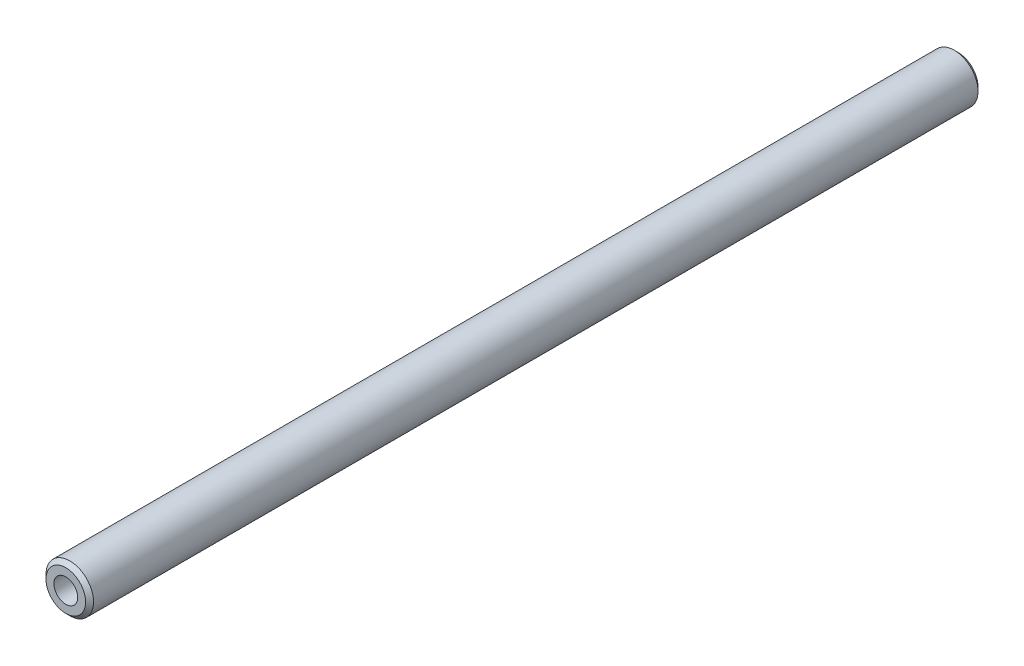
ISO-10303-21;
HEADER;
FILE_DESCRIPTION(('STEP AP214'),'2;1');
FILE_NAME('part.step','',(''),(''),'','','');
FILE_SCHEMA(('AUTOMOTIVE_DESIGN { 1 0 10303 214 1 1 1 1 }'));
ENDSEC;
DATA;
#1=APPLICATION_CONTEXT('core data for automotive mechanical design processes');
#2=APPLICATION_PROTOCOL_DEFINITION('international standard','automotive_design',2000,#1);
#3=PRODUCT_CONTEXT('',#1,'mechanical');
#4=PRODUCT('Part','Part','',(#3));
#5=PRODUCT_RELATED_PRODUCT_CATEGORY('part','',(#4));
#6=PRODUCT_DEFINITION_FORMATION('','',#4);
#7=PRODUCT_DEFINITION_CONTEXT('part definition',#1,'design');
#8=PRODUCT_DEFINITION('design','',#6,#7);
#9=PRODUCT_DEFINITION_SHAPE('','',#8);
#10=(LENGTH_UNIT() NAMED_UNIT(*) SI_UNIT(.MILLI.,.METRE.));
#11=(NAMED_UNIT(*) PLANE_ANGLE_UNIT() SI_UNIT($,.RADIAN.));
#12=(NAMED_UNIT(*) SI_UNIT($,.STERADIAN.) SOLID_ANGLE_UNIT());
#13=UNCERTAINTY_MEASURE_WITH_UNIT(LENGTH_MEASURE(1.E-05),#10,'distance_accuracy_value','');
#14=(GEOMETRIC_REPRESENTATION_CONTEXT(3) GLOBAL_UNCERTAINTY_ASSIGNED_CONTEXT((#13)) GLOBAL_UNIT_ASSIGNED_CONTEXT((#10,
#11,#12)) REPRESENTATION_CONTEXT('',''));
#15=CARTESIAN_POINT('',(0.,0.,0.));
#16=DIRECTION('',(0.,0.,1.));
#17=DIRECTION('',(1.,0.,0.));
#18=AXIS2_PLACEMENT_3D('',#15,#16,#17);
#19=CARTESIAN_POINT('',(0.,0.,225.));
#20=DIRECTION('',(0.,0.,1.));
#21=DIRECTION('',(1.,0.,0.));
#22=AXIS2_PLACEMENT_3D('',#19,#20,#21);
#23=PLANE('',#22);
#24=CARTESIAN_POINT('',(0.,0.,225.));
#25=DIRECTION('',(0.,0.,1.));
#26=DIRECTION('',(1.,0.,0.));
#27=AXIS2_PLACEMENT_3D('',#24,#25,#26);
#28=CIRCLE('',#27,4.99999999999998);
#29=CARTESIAN_POINT('',(4.99999999999998,0.,225.));
#30=VERTEX_POINT('',#29);
#31=EDGE_CURVE('E51',#30,#30,#28,.T.);
#32=ORIENTED_EDGE('',*,*,#31,.T.);
#33=EDGE_LOOP('',(#32));
#34=FACE_BOUND('',#33,.T.);
#35=CARTESIAN_POINT('',(0.,0.,225.));
#36=DIRECTION('',(0.,0.,1.));
#37=DIRECTION('',(1.,0.,0.));
#38=AXIS2_PLACEMENT_3D('',#35,#36,#37);
#39=CIRCLE('',#38,3.);
#40=CARTESIAN_POINT('',(3.,0.,225.));
#41=VERTEX_POINT('',#40);
#42=EDGE_CURVE('E56',#41,#41,#39,.T.);
#43=ORIENTED_EDGE('',*,*,#42,.F.);
#44=EDGE_LOOP('',(#43));
#45=FACE_BOUND('',#44,.T.);
#46=ADVANCED_FACE('F35',(#34,#45),#23,.T.);
#47=CARTESIAN_POINT('',(0.,0.,0.));
#48=DIRECTION('',(0.,0.,1.));
#49=DIRECTION('',(1.,0.,0.));
#50=AXIS2_PLACEMENT_3D('',#47,#48,#49);
#51=PLANE('',#50);
#52=CARTESIAN_POINT('',(0.,0.,0.));
#53=DIRECTION('',(0.,0.,1.));
#54=DIRECTION('',(1.,0.,0.));
#55=AXIS2_PLACEMENT_3D('',#52,#53,#54);
#56=CIRCLE('',#55,4.99999999999998);
#57=CARTESIAN_POINT('',(4.99999999999998,0.,0.));
#58=VERTEX_POINT('',#57);
#59=EDGE_CURVE('E10',#58,#58,#56,.F.);
#60=ORIENTED_EDGE('',*,*,#59,.T.);
#61=EDGE_LOOP('',(#60));
#62=FACE_BOUND('',#61,.T.);
#63=CARTESIAN_POINT('',(0.,0.,0.));
#64=DIRECTION('',(0.,0.,1.));
#65=DIRECTION('',(1.,0.,0.));
#66=AXIS2_PLACEMENT_3D('',#63,#64,#65);
#67=CIRCLE('',#66,3.);
#68=CARTESIAN_POINT('',(3.,0.,0.));
#69=VERTEX_POINT('',#68);
#70=EDGE_CURVE('E57',#69,#69,#67,.T.);
#71=ORIENTED_EDGE('',*,*,#70,.T.);
#72=EDGE_LOOP('',(#71));
#73=FACE_BOUND('',#72,.T.);
#74=ADVANCED_FACE('F67',(#62,#73),#51,.F.);
#75=CARTESIAN_POINT('',(0.,0.,225.));
#76=DIRECTION('',(0.,0.,-1.));
#77=DIRECTION('',(-1.,0.,0.));
#78=AXIS2_PLACEMENT_3D('',#75,#76,#77);
#79=CYLINDRICAL_SURFACE('',#78,6.);
#80=CARTESIAN_POINT('',(0.,0.,224.));
#81=DIRECTION('',(0.,0.,1.));
#82=DIRECTION('',(1.,0.,0.));
#83=AXIS2_PLACEMENT_3D('',#80,#81,#82);
#84=CIRCLE('',#83,6.);
#85=CARTESIAN_POINT('',(6.,0.,224.));
#86=VERTEX_POINT('',#85);
#87=EDGE_CURVE('E43',#86,#86,#84,.F.);
#88=ORIENTED_EDGE('',*,*,#87,.T.);
#89=EDGE_LOOP('',(#88));
#90=FACE_BOUND('',#89,.T.);
#91=CARTESIAN_POINT('',(0.,0.,1.00000000000003));
#92=DIRECTION('',(0.,0.,1.));
#93=DIRECTION('',(1.,0.,0.));
#94=AXIS2_PLACEMENT_3D('',#91,#92,#93);
#95=CIRCLE('',#94,6.);
#96=CARTESIAN_POINT('',(6.,0.,1.00000000000003));
#97=VERTEX_POINT('',#96);
#98=EDGE_CURVE('E47',#97,#97,#95,.T.);
#99=ORIENTED_EDGE('',*,*,#98,.T.);
#100=EDGE_LOOP('',(#99));
#101=FACE_BOUND('',#100,.T.);
#102=ADVANCED_FACE('F73',(#90,#101),#79,.T.);
#103=CARTESIAN_POINT('',(0.,0.,225.));
#104=DIRECTION('',(0.,0.,-1.));
#105=DIRECTION('',(-1.,0.,0.));
#106=AXIS2_PLACEMENT_3D('',#103,#104,#105);
#107=CYLINDRICAL_SURFACE('',#106,3.);
#108=ORIENTED_EDGE('',*,*,#42,.T.);
#109=EDGE_LOOP('',(#108));
#110=FACE_BOUND('',#109,.T.);
#111=ORIENTED_EDGE('',*,*,#70,.F.);
#112=EDGE_LOOP('',(#111));
#113=FACE_BOUND('',#112,.T.);
#114=ADVANCED_FACE('F63',(#110,#113),#107,.F.);
#115=CARTESIAN_POINT('',(0.,0.,225.));
#116=DIRECTION('',(0.,0.,-1.));
#117=DIRECTION('',(-1.,0.,0.));
#118=AXIS2_PLACEMENT_3D('',#115,#116,#117);
#119=CONICAL_SURFACE('',#118,4.99999999999998,0.785398163397446);
#120=ORIENTED_EDGE('',*,*,#87,.F.);
#121=EDGE_LOOP('',(#120));
#122=FACE_BOUND('',#121,.T.);
#123=ORIENTED_EDGE('',*,*,#31,.F.);
#124=EDGE_LOOP('',(#123));
#125=FACE_BOUND('',#124,.T.);
#126=ADVANCED_FACE('F79',(#122,#125),#119,.T.);
#127=CARTESIAN_POINT('',(0.,0.,1.00000000000003));
#128=DIRECTION('',(0.,0.,1.));
#129=DIRECTION('',(1.,0.,0.));
#130=AXIS2_PLACEMENT_3D('',#127,#128,#129);
#131=CONICAL_SURFACE('',#130,6.,0.785398163397446);
#132=ORIENTED_EDGE('',*,*,#59,.F.);
#133=EDGE_LOOP('',(#132));
#134=FACE_BOUND('',#133,.T.);
#135=ORIENTED_EDGE('',*,*,#98,.F.);
#136=EDGE_LOOP('',(#135));
#137=FACE_BOUND('',#136,.T.);
#138=ADVANCED_FACE('F38',(#134,#137),#131,.T.);
#139=CLOSED_SHELL('',(#46,#74,#102,#114,#126,#138));
#140=MANIFOLD_SOLID_BREP('B2',#139);
#141=ADVANCED_BREP_SHAPE_REPRESENTATION('',(#18,#140),#14);
#142=SHAPE_DEFINITION_REPRESENTATION(#9,#141);
ENDSEC;
END-ISO-10303-21;
